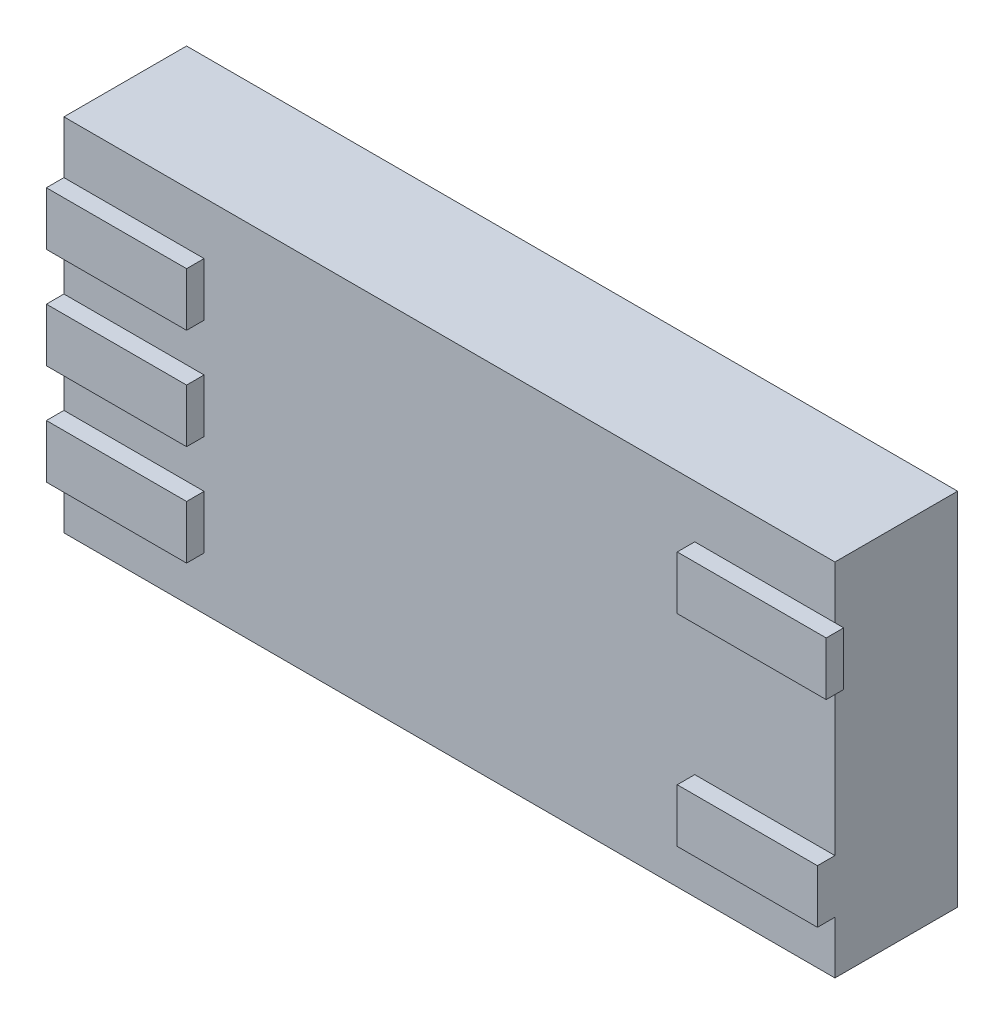
ISO-10303-21;
HEADER;
FILE_DESCRIPTION(('STEP AP214'),'2;1');
FILE_NAME('part.step','',(''),(''),'','','');
FILE_SCHEMA(('AUTOMOTIVE_DESIGN { 1 0 10303 214 1 1 1 1 }'));
ENDSEC;
DATA;
#1=APPLICATION_CONTEXT('core data for automotive mechanical design processes');
#2=APPLICATION_PROTOCOL_DEFINITION('international standard','automotive_design',2000,#1);
#3=PRODUCT_CONTEXT('',#1,'mechanical');
#4=PRODUCT('Part','Part','',(#3));
#5=PRODUCT_RELATED_PRODUCT_CATEGORY('part','',(#4));
#6=PRODUCT_DEFINITION_FORMATION('','',#4);
#7=PRODUCT_DEFINITION_CONTEXT('part definition',#1,'design');
#8=PRODUCT_DEFINITION('design','',#6,#7);
#9=PRODUCT_DEFINITION_SHAPE('','',#8);
#10=(LENGTH_UNIT() NAMED_UNIT(*) SI_UNIT(.MILLI.,.METRE.));
#11=(NAMED_UNIT(*) PLANE_ANGLE_UNIT() SI_UNIT($,.RADIAN.));
#12=(NAMED_UNIT(*) SI_UNIT($,.STERADIAN.) SOLID_ANGLE_UNIT());
#13=UNCERTAINTY_MEASURE_WITH_UNIT(LENGTH_MEASURE(1.E-05),#10,'distance_accuracy_value','');
#14=(GEOMETRIC_REPRESENTATION_CONTEXT(3) GLOBAL_UNCERTAINTY_ASSIGNED_CONTEXT((#13)) GLOBAL_UNIT_ASSIGNED_CONTEXT((#10,
#11,#12)) REPRESENTATION_CONTEXT('',''));
#15=CARTESIAN_POINT('',(0.,0.,0.));
#16=DIRECTION('',(0.,0.,1.));
#17=DIRECTION('',(1.,0.,0.));
#18=AXIS2_PLACEMENT_3D('',#15,#16,#17);
#19=CARTESIAN_POINT('',(55.88,26.1112,8.89));
#20=DIRECTION('',(-1.,0.,0.));
#21=DIRECTION('',(0.,-1.,0.));
#22=AXIS2_PLACEMENT_3D('',#19,#20,#21);
#23=PLANE('',#22);
#24=DIRECTION('',(0.,1.,0.));
#25=VECTOR('',#24,1.);
#26=CARTESIAN_POINT('',(55.88,22.29590234352,8.89));
#27=LINE('',#26,#25);
#28=CARTESIAN_POINT('',(55.88,18.4260321312766,8.89));
#29=VERTEX_POINT('',#28);
#30=CARTESIAN_POINT('',(55.88,22.29590234352,8.89));
#31=VERTEX_POINT('',#30);
#32=EDGE_CURVE('E229',#29,#31,#27,.T.);
#33=ORIENTED_EDGE('',*,*,#32,.F.);
#34=DIRECTION('',(0.,1.,0.));
#35=VECTOR('',#34,1.);
#36=CARTESIAN_POINT('',(55.88,26.1112,8.89));
#37=LINE('',#36,#35);
#38=CARTESIAN_POINT('',(55.88,7.68516786872343,8.89));
#39=VERTEX_POINT('',#38);
#40=EDGE_CURVE('E400',#39,#29,#37,.T.);
#41=ORIENTED_EDGE('',*,*,#40,.F.);
#42=DIRECTION('',(0.,0.,-1.));
#43=VECTOR('',#42,1.);
#44=CARTESIAN_POINT('',(55.88,7.68516786872343,10.16));
#45=LINE('',#44,#43);
#46=CARTESIAN_POINT('',(55.88,7.68516786872343,10.16));
#47=VERTEX_POINT('',#46);
#48=EDGE_CURVE('E272',#47,#39,#45,.T.);
#49=ORIENTED_EDGE('',*,*,#48,.F.);
#50=DIRECTION('',(0.,1.,0.));
#51=VECTOR('',#50,1.);
#52=CARTESIAN_POINT('',(55.88,7.68516786872343,10.16));
#53=LINE('',#52,#51);
#54=CARTESIAN_POINT('',(55.88,3.81529765647998,10.16));
#55=VERTEX_POINT('',#54);
#56=EDGE_CURVE('E258',#55,#47,#53,.T.);
#57=ORIENTED_EDGE('',*,*,#56,.F.);
#58=DIRECTION('',(0.,0.,-1.));
#59=VECTOR('',#58,1.);
#60=CARTESIAN_POINT('',(55.88,3.81529765647998,10.16));
#61=LINE('',#60,#59);
#62=CARTESIAN_POINT('',(55.88,3.81529765647998,8.89));
#63=VERTEX_POINT('',#62);
#64=EDGE_CURVE('E275',#55,#63,#61,.T.);
#65=ORIENTED_EDGE('',*,*,#64,.T.);
#66=CARTESIAN_POINT('',(55.88,0.,8.89));
#67=VERTEX_POINT('',#66);
#68=EDGE_CURVE('E399',#67,#63,#37,.T.);
#69=ORIENTED_EDGE('',*,*,#68,.F.);
#70=DIRECTION('',(0.,0.,-1.));
#71=VECTOR('',#70,1.);
#72=CARTESIAN_POINT('',(55.88,0.,8.89));
#73=LINE('',#72,#71);
#74=CARTESIAN_POINT('',(55.88,0.,0.));
#75=VERTEX_POINT('',#74);
#76=EDGE_CURVE('E45',#67,#75,#73,.T.);
#77=ORIENTED_EDGE('',*,*,#76,.T.);
#78=DIRECTION('',(0.,1.,0.));
#79=VECTOR('',#78,1.);
#80=CARTESIAN_POINT('',(55.88,26.1112,0.));
#81=LINE('',#80,#79);
#82=CARTESIAN_POINT('',(55.88,26.1112,0.));
#83=VERTEX_POINT('',#82);
#84=EDGE_CURVE('E391',#75,#83,#81,.T.);
#85=ORIENTED_EDGE('',*,*,#84,.T.);
#86=DIRECTION('',(0.,0.,-1.));
#87=VECTOR('',#86,1.);
#88=CARTESIAN_POINT('',(55.88,26.1112,8.89));
#89=LINE('',#88,#87);
#90=CARTESIAN_POINT('',(55.88,26.1112,8.89));
#91=VERTEX_POINT('',#90);
#92=EDGE_CURVE('E383',#91,#83,#89,.T.);
#93=ORIENTED_EDGE('',*,*,#92,.F.);
#94=EDGE_CURVE('E401',#31,#91,#37,.T.);
#95=ORIENTED_EDGE('',*,*,#94,.F.);
#96=EDGE_LOOP('',(#33,#41,#49,#57,#65,#69,#77,#85,#93,#95));
#97=FACE_BOUND('',#96,.T.);
#98=ADVANCED_FACE('F35',(#97),#23,.F.);
#99=CARTESIAN_POINT('',(0.,0.,8.89));
#100=DIRECTION('',(0.,0.,1.));
#101=DIRECTION('',(1.,0.,0.));
#102=AXIS2_PLACEMENT_3D('',#99,#100,#101);
#103=PLANE('',#102);
#104=ORIENTED_EDGE('',*,*,#40,.T.);
#105=DIRECTION('',(1.,0.,0.));
#106=VECTOR('',#105,1.);
#107=CARTESIAN_POINT('',(45.72,18.4260321312766,8.89));
#108=LINE('',#107,#106);
#109=CARTESIAN_POINT('',(45.72,18.4260321312766,8.89));
#110=VERTEX_POINT('',#109);
#111=EDGE_CURVE('E53',#110,#29,#108,.T.);
#112=ORIENTED_EDGE('',*,*,#111,.F.);
#113=DIRECTION('',(0.,-1.,0.));
#114=VECTOR('',#113,1.);
#115=CARTESIAN_POINT('',(45.72,22.29590234352,8.89));
#116=LINE('',#115,#114);
#117=CARTESIAN_POINT('',(45.72,22.29590234352,8.89));
#118=VERTEX_POINT('',#117);
#119=EDGE_CURVE('E58',#118,#110,#116,.T.);
#120=ORIENTED_EDGE('',*,*,#119,.F.);
#121=DIRECTION('',(-1.,0.,0.));
#122=VECTOR('',#121,1.);
#123=CARTESIAN_POINT('',(45.72,22.29590234352,8.89));
#124=LINE('',#123,#122);
#125=EDGE_CURVE('E240',#31,#118,#124,.T.);
#126=ORIENTED_EDGE('',*,*,#125,.F.);
#127=ORIENTED_EDGE('',*,*,#94,.T.);
#128=DIRECTION('',(-1.,0.,0.));
#129=VECTOR('',#128,1.);
#130=CARTESIAN_POINT('',(0.,26.1112,8.89));
#131=LINE('',#130,#129);
#132=CARTESIAN_POINT('',(0.,26.1112,8.89));
#133=VERTEX_POINT('',#132);
#134=EDGE_CURVE('E389',#91,#133,#131,.T.);
#135=ORIENTED_EDGE('',*,*,#134,.T.);
#136=DIRECTION('',(0.,-1.,0.));
#137=VECTOR('',#136,1.);
#138=CARTESIAN_POINT('',(0.,26.1112,8.89));
#139=LINE('',#138,#137);
#140=CARTESIAN_POINT('',(0.,22.29590234352,8.89));
#141=VERTEX_POINT('',#140);
#142=EDGE_CURVE('E379',#133,#141,#139,.T.);
#143=ORIENTED_EDGE('',*,*,#142,.T.);
#144=DIRECTION('',(-1.,0.,0.));
#145=VECTOR('',#144,1.);
#146=CARTESIAN_POINT('',(0.,22.29590234352,8.89));
#147=LINE('',#146,#145);
#148=CARTESIAN_POINT('',(10.16,22.29590234352,8.89));
#149=VERTEX_POINT('',#148);
#150=EDGE_CURVE('E286',#149,#141,#147,.T.);
#151=ORIENTED_EDGE('',*,*,#150,.F.);
#152=DIRECTION('',(0.,1.,0.));
#153=VECTOR('',#152,1.);
#154=CARTESIAN_POINT('',(10.16,22.29590234352,8.89));
#155=LINE('',#154,#153);
#156=CARTESIAN_POINT('',(10.16,18.4260321312766,8.89));
#157=VERTEX_POINT('',#156);
#158=EDGE_CURVE('E295',#157,#149,#155,.T.);
#159=ORIENTED_EDGE('',*,*,#158,.F.);
#160=DIRECTION('',(1.,0.,0.));
#161=VECTOR('',#160,1.);
#162=CARTESIAN_POINT('',(0.,18.4260321312766,8.89));
#163=LINE('',#162,#161);
#164=CARTESIAN_POINT('',(0.,18.4260321312766,8.89));
#165=VERTEX_POINT('',#164);
#166=EDGE_CURVE('E281',#165,#157,#163,.T.);
#167=ORIENTED_EDGE('',*,*,#166,.F.);
#168=CARTESIAN_POINT('',(0.,14.9905351061217,8.89));
#169=VERTEX_POINT('',#168);
#170=EDGE_CURVE('E39',#165,#169,#139,.T.);
#171=ORIENTED_EDGE('',*,*,#170,.T.);
#172=DIRECTION('',(-1.,0.,0.));
#173=VECTOR('',#172,1.);
#174=CARTESIAN_POINT('',(0.,14.9905351061217,8.89));
#175=LINE('',#174,#173);
#176=CARTESIAN_POINT('',(10.16,14.9905351061217,8.89));
#177=VERTEX_POINT('',#176);
#178=EDGE_CURVE('E342',#177,#169,#175,.T.);
#179=ORIENTED_EDGE('',*,*,#178,.F.);
#180=DIRECTION('',(0.,1.,0.));
#181=VECTOR('',#180,1.);
#182=CARTESIAN_POINT('',(10.16,14.9905351061217,8.89));
#183=LINE('',#182,#181);
#184=CARTESIAN_POINT('',(10.16,11.1206648938783,8.89));
#185=VERTEX_POINT('',#184);
#186=EDGE_CURVE('E349',#185,#177,#183,.T.);
#187=ORIENTED_EDGE('',*,*,#186,.F.);
#188=DIRECTION('',(1.,0.,0.));
#189=VECTOR('',#188,1.);
#190=CARTESIAN_POINT('',(0.,11.1206648938783,8.89));
#191=LINE('',#190,#189);
#192=CARTESIAN_POINT('',(0.,11.1206648938783,8.89));
#193=VERTEX_POINT('',#192);
#194=EDGE_CURVE('E337',#193,#185,#191,.T.);
#195=ORIENTED_EDGE('',*,*,#194,.F.);
#196=CARTESIAN_POINT('',(0.,7.68516786872344,8.89));
#197=VERTEX_POINT('',#196);
#198=EDGE_CURVE('E366',#193,#197,#139,.T.);
#199=ORIENTED_EDGE('',*,*,#198,.T.);
#200=DIRECTION('',(-1.,0.,0.));
#201=VECTOR('',#200,1.);
#202=CARTESIAN_POINT('',(0.,7.68516786872344,8.89));
#203=LINE('',#202,#201);
#204=CARTESIAN_POINT('',(10.16,7.68516786872344,8.89));
#205=VERTEX_POINT('',#204);
#206=EDGE_CURVE('E316',#205,#197,#203,.T.);
#207=ORIENTED_EDGE('',*,*,#206,.F.);
#208=DIRECTION('',(0.,1.,0.));
#209=VECTOR('',#208,1.);
#210=CARTESIAN_POINT('',(10.16,7.68516786872344,8.89));
#211=LINE('',#210,#209);
#212=CARTESIAN_POINT('',(10.16,3.81529765647998,8.89));
#213=VERTEX_POINT('',#212);
#214=EDGE_CURVE('E324',#213,#205,#211,.T.);
#215=ORIENTED_EDGE('',*,*,#214,.F.);
#216=DIRECTION('',(1.,0.,0.));
#217=VECTOR('',#216,1.);
#218=CARTESIAN_POINT('',(0.,3.81529765647998,8.89));
#219=LINE('',#218,#217);
#220=CARTESIAN_POINT('',(0.,3.81529765647998,8.89));
#221=VERTEX_POINT('',#220);
#222=EDGE_CURVE('E311',#221,#213,#219,.T.);
#223=ORIENTED_EDGE('',*,*,#222,.F.);
#224=CARTESIAN_POINT('',(0.,0.,8.89));
#225=VERTEX_POINT('',#224);
#226=EDGE_CURVE('E365',#221,#225,#139,.T.);
#227=ORIENTED_EDGE('',*,*,#226,.T.);
#228=DIRECTION('',(1.,0.,0.));
#229=VECTOR('',#228,1.);
#230=CARTESIAN_POINT('',(0.,0.,8.89));
#231=LINE('',#230,#229);
#232=EDGE_CURVE('E371',#225,#67,#231,.T.);
#233=ORIENTED_EDGE('',*,*,#232,.T.);
#234=ORIENTED_EDGE('',*,*,#68,.T.);
#235=DIRECTION('',(1.,0.,0.));
#236=VECTOR('',#235,1.);
#237=CARTESIAN_POINT('',(45.72,3.81529765647998,8.89));
#238=LINE('',#237,#236);
#239=CARTESIAN_POINT('',(45.72,3.81529765647998,8.89));
#240=VERTEX_POINT('',#239);
#241=EDGE_CURVE('E265',#240,#63,#238,.T.);
#242=ORIENTED_EDGE('',*,*,#241,.F.);
#243=DIRECTION('',(0.,-1.,0.));
#244=VECTOR('',#243,1.);
#245=CARTESIAN_POINT('',(45.72,7.68516786872343,8.89));
#246=LINE('',#245,#244);
#247=CARTESIAN_POINT('',(45.72,7.68516786872343,8.89));
#248=VERTEX_POINT('',#247);
#249=EDGE_CURVE('E251',#248,#240,#246,.T.);
#250=ORIENTED_EDGE('',*,*,#249,.F.);
#251=DIRECTION('',(-1.,0.,0.));
#252=VECTOR('',#251,1.);
#253=CARTESIAN_POINT('',(45.72,7.68516786872343,8.89));
#254=LINE('',#253,#252);
#255=EDGE_CURVE('E256',#39,#248,#254,.T.);
#256=ORIENTED_EDGE('',*,*,#255,.F.);
#257=EDGE_LOOP('',(#104,#112,#120,#126,#127,#135,#143,#151,#159,#167,#171,#179,#187,#195,#199,
#207,#215,#223,#227,#233,#234,#242,#250,#256));
#258=FACE_BOUND('',#257,.T.);
#259=ADVANCED_FACE('F407',(#258),#103,.T.);
#260=CARTESIAN_POINT('',(0.,26.1112,8.89));
#261=DIRECTION('',(1.,0.,0.));
#262=DIRECTION('',(0.,1.,0.));
#263=AXIS2_PLACEMENT_3D('',#260,#261,#262);
#264=PLANE('',#263);
#265=DIRECTION('',(0.,-1.,0.));
#266=VECTOR('',#265,1.);
#267=CARTESIAN_POINT('',(0.,26.1112,0.));
#268=LINE('',#267,#266);
#269=CARTESIAN_POINT('',(0.,26.1112,0.));
#270=VERTEX_POINT('',#269);
#271=CARTESIAN_POINT('',(0.,0.,0.));
#272=VERTEX_POINT('',#271);
#273=EDGE_CURVE('E395',#270,#272,#268,.T.);
#274=ORIENTED_EDGE('',*,*,#273,.T.);
#275=DIRECTION('',(0.,0.,-1.));
#276=VECTOR('',#275,1.);
#277=CARTESIAN_POINT('',(0.,0.,8.89));
#278=LINE('',#277,#276);
#279=EDGE_CURVE('E11',#225,#272,#278,.T.);
#280=ORIENTED_EDGE('',*,*,#279,.F.);
#281=ORIENTED_EDGE('',*,*,#226,.F.);
#282=DIRECTION('',(0.,0.,-1.));
#283=VECTOR('',#282,1.);
#284=CARTESIAN_POINT('',(0.,3.81529765647998,10.16));
#285=LINE('',#284,#283);
#286=CARTESIAN_POINT('',(0.,3.81529765647998,10.16));
#287=VERTEX_POINT('',#286);
#288=EDGE_CURVE('E335',#287,#221,#285,.T.);
#289=ORIENTED_EDGE('',*,*,#288,.F.);
#290=DIRECTION('',(0.,-1.,0.));
#291=VECTOR('',#290,1.);
#292=CARTESIAN_POINT('',(0.,7.68516786872344,10.16));
#293=LINE('',#292,#291);
#294=CARTESIAN_POINT('',(0.,7.68516786872344,10.16));
#295=VERTEX_POINT('',#294);
#296=EDGE_CURVE('E312',#295,#287,#293,.T.);
#297=ORIENTED_EDGE('',*,*,#296,.F.);
#298=DIRECTION('',(0.,0.,-1.));
#299=VECTOR('',#298,1.);
#300=CARTESIAN_POINT('',(0.,7.68516786872344,10.16));
#301=LINE('',#300,#299);
#302=EDGE_CURVE('E322',#295,#197,#301,.T.);
#303=ORIENTED_EDGE('',*,*,#302,.T.);
#304=ORIENTED_EDGE('',*,*,#198,.F.);
#305=DIRECTION('',(0.,0.,-1.));
#306=VECTOR('',#305,1.);
#307=CARTESIAN_POINT('',(0.,11.1206648938783,10.16));
#308=LINE('',#307,#306);
#309=CARTESIAN_POINT('',(0.,11.1206648938783,10.16));
#310=VERTEX_POINT('',#309);
#311=EDGE_CURVE('E398',#310,#193,#308,.T.);
#312=ORIENTED_EDGE('',*,*,#311,.F.);
#313=DIRECTION('',(0.,-1.,0.));
#314=VECTOR('',#313,1.);
#315=CARTESIAN_POINT('',(0.,14.9905351061217,10.16));
#316=LINE('',#315,#314);
#317=CARTESIAN_POINT('',(0.,14.9905351061217,10.16));
#318=VERTEX_POINT('',#317);
#319=EDGE_CURVE('E338',#318,#310,#316,.T.);
#320=ORIENTED_EDGE('',*,*,#319,.F.);
#321=DIRECTION('',(0.,0.,-1.));
#322=VECTOR('',#321,1.);
#323=CARTESIAN_POINT('',(0.,14.9905351061217,10.16));
#324=LINE('',#323,#322);
#325=EDGE_CURVE('E348',#318,#169,#324,.T.);
#326=ORIENTED_EDGE('',*,*,#325,.T.);
#327=ORIENTED_EDGE('',*,*,#170,.F.);
#328=DIRECTION('',(0.,0.,-1.));
#329=VECTOR('',#328,1.);
#330=CARTESIAN_POINT('',(0.,18.4260321312766,10.16));
#331=LINE('',#330,#329);
#332=CARTESIAN_POINT('',(0.,18.4260321312766,10.16));
#333=VERTEX_POINT('',#332);
#334=EDGE_CURVE('E308',#333,#165,#331,.T.);
#335=ORIENTED_EDGE('',*,*,#334,.F.);
#336=DIRECTION('',(0.,-1.,0.));
#337=VECTOR('',#336,1.);
#338=CARTESIAN_POINT('',(0.,22.29590234352,10.16));
#339=LINE('',#338,#337);
#340=CARTESIAN_POINT('',(0.,22.29590234352,10.16));
#341=VERTEX_POINT('',#340);
#342=EDGE_CURVE('E282',#341,#333,#339,.T.);
#343=ORIENTED_EDGE('',*,*,#342,.F.);
#344=DIRECTION('',(0.,0.,-1.));
#345=VECTOR('',#344,1.);
#346=CARTESIAN_POINT('',(0.,22.29590234352,10.16));
#347=LINE('',#346,#345);
#348=EDGE_CURVE('E292',#341,#141,#347,.T.);
#349=ORIENTED_EDGE('',*,*,#348,.T.);
#350=ORIENTED_EDGE('',*,*,#142,.F.);
#351=DIRECTION('',(0.,0.,-1.));
#352=VECTOR('',#351,1.);
#353=CARTESIAN_POINT('',(0.,26.1112,8.89));
#354=LINE('',#353,#352);
#355=EDGE_CURVE('E386',#133,#270,#354,.T.);
#356=ORIENTED_EDGE('',*,*,#355,.T.);
#357=EDGE_LOOP('',(#274,#280,#281,#289,#297,#303,#304,#312,#320,#326,#327,#335,#343,#349,#350,#356));
#358=FACE_BOUND('',#357,.T.);
#359=ADVANCED_FACE('F37',(#358),#264,.F.);
#360=CARTESIAN_POINT('',(0.,0.,8.89));
#361=DIRECTION('',(0.,1.,0.));
#362=DIRECTION('',(0.,0.,1.));
#363=AXIS2_PLACEMENT_3D('',#360,#361,#362);
#364=PLANE('',#363);
#365=DIRECTION('',(1.,0.,0.));
#366=VECTOR('',#365,1.);
#367=CARTESIAN_POINT('',(0.,0.,0.));
#368=LINE('',#367,#366);
#369=EDGE_CURVE('E393',#272,#75,#368,.T.);
#370=ORIENTED_EDGE('',*,*,#369,.T.);
#371=ORIENTED_EDGE('',*,*,#76,.F.);
#372=ORIENTED_EDGE('',*,*,#232,.F.);
#373=ORIENTED_EDGE('',*,*,#279,.T.);
#374=EDGE_LOOP('',(#370,#371,#372,#373));
#375=FACE_BOUND('',#374,.T.);
#376=ADVANCED_FACE('F412',(#375),#364,.F.);
#377=CARTESIAN_POINT('',(0.,26.1112,8.89));
#378=DIRECTION('',(0.,-1.,0.));
#379=DIRECTION('',(1.,0.,0.));
#380=AXIS2_PLACEMENT_3D('',#377,#378,#379);
#381=PLANE('',#380);
#382=DIRECTION('',(-1.,0.,0.));
#383=VECTOR('',#382,1.);
#384=CARTESIAN_POINT('',(0.,26.1112,0.));
#385=LINE('',#384,#383);
#386=EDGE_CURVE('E367',#83,#270,#385,.T.);
#387=ORIENTED_EDGE('',*,*,#386,.T.);
#388=ORIENTED_EDGE('',*,*,#355,.F.);
#389=ORIENTED_EDGE('',*,*,#134,.F.);
#390=ORIENTED_EDGE('',*,*,#92,.T.);
#391=EDGE_LOOP('',(#387,#388,#389,#390));
#392=FACE_BOUND('',#391,.T.);
#393=ADVANCED_FACE('F454',(#392),#381,.F.);
#394=CARTESIAN_POINT('',(0.,0.,0.));
#395=DIRECTION('',(0.,0.,1.));
#396=DIRECTION('',(1.,0.,0.));
#397=AXIS2_PLACEMENT_3D('',#394,#395,#396);
#398=PLANE('',#397);
#399=ORIENTED_EDGE('',*,*,#273,.F.);
#400=ORIENTED_EDGE('',*,*,#386,.F.);
#401=ORIENTED_EDGE('',*,*,#84,.F.);
#402=ORIENTED_EDGE('',*,*,#369,.F.);
#403=EDGE_LOOP('',(#399,#400,#401,#402));
#404=FACE_BOUND('',#403,.T.);
#405=ADVANCED_FACE('F461',(#404),#398,.F.);
#406=CARTESIAN_POINT('',(0.,11.1206648938783,10.16));
#407=DIRECTION('',(0.,1.,0.));
#408=DIRECTION('',(0.,0.,1.));
#409=AXIS2_PLACEMENT_3D('',#406,#407,#408);
#410=PLANE('',#409);
#411=ORIENTED_EDGE('',*,*,#194,.T.);
#412=DIRECTION('',(0.,0.,-1.));
#413=VECTOR('',#412,1.);
#414=CARTESIAN_POINT('',(10.16,11.1206648938783,10.16));
#415=LINE('',#414,#413);
#416=CARTESIAN_POINT('',(10.16,11.1206648938783,10.16));
#417=VERTEX_POINT('',#416);
#418=EDGE_CURVE('E370',#417,#185,#415,.T.);
#419=ORIENTED_EDGE('',*,*,#418,.F.);
#420=DIRECTION('',(1.,0.,0.));
#421=VECTOR('',#420,1.);
#422=CARTESIAN_POINT('',(0.,11.1206648938783,10.16));
#423=LINE('',#422,#421);
#424=EDGE_CURVE('E341',#310,#417,#423,.T.);
#425=ORIENTED_EDGE('',*,*,#424,.F.);
#426=ORIENTED_EDGE('',*,*,#311,.T.);
#427=EDGE_LOOP('',(#411,#419,#425,#426));
#428=FACE_BOUND('',#427,.T.);
#429=ADVANCED_FACE('F523',(#428),#410,.F.);
#430=CARTESIAN_POINT('',(10.16,14.9905351061217,10.16));
#431=DIRECTION('',(-1.,0.,0.));
#432=DIRECTION('',(0.,0.,1.));
#433=AXIS2_PLACEMENT_3D('',#430,#431,#432);
#434=PLANE('',#433);
#435=ORIENTED_EDGE('',*,*,#186,.T.);
#436=DIRECTION('',(0.,0.,-1.));
#437=VECTOR('',#436,1.);
#438=CARTESIAN_POINT('',(10.16,14.9905351061217,10.16));
#439=LINE('',#438,#437);
#440=CARTESIAN_POINT('',(10.16,14.9905351061217,10.16));
#441=VERTEX_POINT('',#440);
#442=EDGE_CURVE('E354',#441,#177,#439,.T.);
#443=ORIENTED_EDGE('',*,*,#442,.F.);
#444=DIRECTION('',(0.,1.,0.));
#445=VECTOR('',#444,1.);
#446=CARTESIAN_POINT('',(10.16,14.9905351061217,10.16));
#447=LINE('',#446,#445);
#448=EDGE_CURVE('E344',#417,#441,#447,.T.);
#449=ORIENTED_EDGE('',*,*,#448,.F.);
#450=ORIENTED_EDGE('',*,*,#418,.T.);
#451=EDGE_LOOP('',(#435,#443,#449,#450));
#452=FACE_BOUND('',#451,.T.);
#453=ADVANCED_FACE('F519',(#452),#434,.F.);
#454=CARTESIAN_POINT('',(0.,14.9905351061217,10.16));
#455=DIRECTION('',(0.,-1.,0.));
#456=DIRECTION('',(0.,0.,-1.));
#457=AXIS2_PLACEMENT_3D('',#454,#455,#456);
#458=PLANE('',#457);
#459=ORIENTED_EDGE('',*,*,#178,.T.);
#460=ORIENTED_EDGE('',*,*,#325,.F.);
#461=DIRECTION('',(-1.,0.,0.));
#462=VECTOR('',#461,1.);
#463=CARTESIAN_POINT('',(0.,14.9905351061217,10.16));
#464=LINE('',#463,#462);
#465=EDGE_CURVE('E346',#441,#318,#464,.T.);
#466=ORIENTED_EDGE('',*,*,#465,.F.);
#467=ORIENTED_EDGE('',*,*,#442,.T.);
#468=EDGE_LOOP('',(#459,#460,#466,#467));
#469=FACE_BOUND('',#468,.T.);
#470=ADVANCED_FACE('F515',(#469),#458,.F.);
#471=CARTESIAN_POINT('',(0.,0.,10.16));
#472=DIRECTION('',(0.,0.,1.));
#473=DIRECTION('',(1.,0.,0.));
#474=AXIS2_PLACEMENT_3D('',#471,#472,#473);
#475=PLANE('',#474);
#476=ORIENTED_EDGE('',*,*,#319,.T.);
#477=ORIENTED_EDGE('',*,*,#424,.T.);
#478=ORIENTED_EDGE('',*,*,#448,.T.);
#479=ORIENTED_EDGE('',*,*,#465,.T.);
#480=EDGE_LOOP('',(#476,#477,#478,#479));
#481=FACE_BOUND('',#480,.T.);
#482=ADVANCED_FACE('F511',(#481),#475,.T.);
#483=CARTESIAN_POINT('',(0.,3.81529765647998,10.16));
#484=DIRECTION('',(0.,1.,0.));
#485=DIRECTION('',(0.,0.,1.));
#486=AXIS2_PLACEMENT_3D('',#483,#484,#485);
#487=PLANE('',#486);
#488=ORIENTED_EDGE('',*,*,#222,.T.);
#489=DIRECTION('',(0.,0.,-1.));
#490=VECTOR('',#489,1.);
#491=CARTESIAN_POINT('',(10.16,3.81529765647998,10.16));
#492=LINE('',#491,#490);
#493=CARTESIAN_POINT('',(10.16,3.81529765647998,10.16));
#494=VERTEX_POINT('',#493);
#495=EDGE_CURVE('E332',#494,#213,#492,.T.);
#496=ORIENTED_EDGE('',*,*,#495,.F.);
#497=DIRECTION('',(1.,0.,0.));
#498=VECTOR('',#497,1.);
#499=CARTESIAN_POINT('',(0.,3.81529765647998,10.16));
#500=LINE('',#499,#498);
#501=EDGE_CURVE('E315',#287,#494,#500,.T.);
#502=ORIENTED_EDGE('',*,*,#501,.F.);
#503=ORIENTED_EDGE('',*,*,#288,.T.);
#504=EDGE_LOOP('',(#488,#496,#502,#503));
#505=FACE_BOUND('',#504,.T.);
#506=ADVANCED_FACE('F507',(#505),#487,.F.);
#507=CARTESIAN_POINT('',(10.16,7.68516786872344,10.16));
#508=DIRECTION('',(-1.,0.,0.));
#509=DIRECTION('',(0.,0.,1.));
#510=AXIS2_PLACEMENT_3D('',#507,#508,#509);
#511=PLANE('',#510);
#512=ORIENTED_EDGE('',*,*,#214,.T.);
#513=DIRECTION('',(0.,0.,-1.));
#514=VECTOR('',#513,1.);
#515=CARTESIAN_POINT('',(10.16,7.68516786872344,10.16));
#516=LINE('',#515,#514);
#517=CARTESIAN_POINT('',(10.16,7.68516786872344,10.16));
#518=VERTEX_POINT('',#517);
#519=EDGE_CURVE('E330',#518,#205,#516,.T.);
#520=ORIENTED_EDGE('',*,*,#519,.F.);
#521=DIRECTION('',(0.,1.,0.));
#522=VECTOR('',#521,1.);
#523=CARTESIAN_POINT('',(10.16,7.68516786872344,10.16));
#524=LINE('',#523,#522);
#525=EDGE_CURVE('E318',#494,#518,#524,.T.);
#526=ORIENTED_EDGE('',*,*,#525,.F.);
#527=ORIENTED_EDGE('',*,*,#495,.T.);
#528=EDGE_LOOP('',(#512,#520,#526,#527));
#529=FACE_BOUND('',#528,.T.);
#530=ADVANCED_FACE('F503',(#529),#511,.F.);
#531=CARTESIAN_POINT('',(0.,7.68516786872344,10.16));
#532=DIRECTION('',(0.,-1.,0.));
#533=DIRECTION('',(1.,0.,0.));
#534=AXIS2_PLACEMENT_3D('',#531,#532,#533);
#535=PLANE('',#534);
#536=ORIENTED_EDGE('',*,*,#206,.T.);
#537=ORIENTED_EDGE('',*,*,#302,.F.);
#538=DIRECTION('',(-1.,0.,0.));
#539=VECTOR('',#538,1.);
#540=CARTESIAN_POINT('',(0.,7.68516786872344,10.16));
#541=LINE('',#540,#539);
#542=EDGE_CURVE('E320',#518,#295,#541,.T.);
#543=ORIENTED_EDGE('',*,*,#542,.F.);
#544=ORIENTED_EDGE('',*,*,#519,.T.);
#545=EDGE_LOOP('',(#536,#537,#543,#544));
#546=FACE_BOUND('',#545,.T.);
#547=ADVANCED_FACE('F496',(#546),#535,.F.);
#548=CARTESIAN_POINT('',(0.,0.,10.16));
#549=DIRECTION('',(0.,0.,1.));
#550=DIRECTION('',(1.,0.,0.));
#551=AXIS2_PLACEMENT_3D('',#548,#549,#550);
#552=PLANE('',#551);
#553=ORIENTED_EDGE('',*,*,#296,.T.);
#554=ORIENTED_EDGE('',*,*,#501,.T.);
#555=ORIENTED_EDGE('',*,*,#525,.T.);
#556=ORIENTED_EDGE('',*,*,#542,.T.);
#557=EDGE_LOOP('',(#553,#554,#555,#556));
#558=FACE_BOUND('',#557,.T.);
#559=ADVANCED_FACE('F489',(#558),#552,.T.);
#560=CARTESIAN_POINT('',(0.,18.4260321312766,10.16));
#561=DIRECTION('',(0.,1.,0.));
#562=DIRECTION('',(0.,0.,1.));
#563=AXIS2_PLACEMENT_3D('',#560,#561,#562);
#564=PLANE('',#563);
#565=ORIENTED_EDGE('',*,*,#166,.T.);
#566=DIRECTION('',(0.,0.,-1.));
#567=VECTOR('',#566,1.);
#568=CARTESIAN_POINT('',(10.16,18.4260321312766,10.16));
#569=LINE('',#568,#567);
#570=CARTESIAN_POINT('',(10.16,18.4260321312766,10.16));
#571=VERTEX_POINT('',#570);
#572=EDGE_CURVE('E305',#571,#157,#569,.T.);
#573=ORIENTED_EDGE('',*,*,#572,.F.);
#574=DIRECTION('',(1.,0.,0.));
#575=VECTOR('',#574,1.);
#576=CARTESIAN_POINT('',(0.,18.4260321312766,10.16));
#577=LINE('',#576,#575);
#578=EDGE_CURVE('E285',#333,#571,#577,.T.);
#579=ORIENTED_EDGE('',*,*,#578,.F.);
#580=ORIENTED_EDGE('',*,*,#334,.T.);
#581=EDGE_LOOP('',(#565,#573,#579,#580));
#582=FACE_BOUND('',#581,.T.);
#583=ADVANCED_FACE('F487',(#582),#564,.F.);
#584=CARTESIAN_POINT('',(10.16,22.29590234352,10.16));
#585=DIRECTION('',(-1.,0.,0.));
#586=DIRECTION('',(0.,-1.,0.));
#587=AXIS2_PLACEMENT_3D('',#584,#585,#586);
#588=PLANE('',#587);
#589=ORIENTED_EDGE('',*,*,#158,.T.);
#590=DIRECTION('',(0.,0.,-1.));
#591=VECTOR('',#590,1.);
#592=CARTESIAN_POINT('',(10.16,22.29590234352,10.16));
#593=LINE('',#592,#591);
#594=CARTESIAN_POINT('',(10.16,22.29590234352,10.16));
#595=VERTEX_POINT('',#594);
#596=EDGE_CURVE('E302',#595,#149,#593,.T.);
#597=ORIENTED_EDGE('',*,*,#596,.F.);
#598=DIRECTION('',(0.,1.,0.));
#599=VECTOR('',#598,1.);
#600=CARTESIAN_POINT('',(10.16,22.29590234352,10.16));
#601=LINE('',#600,#599);
#602=EDGE_CURVE('E288',#571,#595,#601,.T.);
#603=ORIENTED_EDGE('',*,*,#602,.F.);
#604=ORIENTED_EDGE('',*,*,#572,.T.);
#605=EDGE_LOOP('',(#589,#597,#603,#604));
#606=FACE_BOUND('',#605,.T.);
#607=ADVANCED_FACE('F484',(#606),#588,.F.);
#608=CARTESIAN_POINT('',(0.,22.29590234352,10.16));
#609=DIRECTION('',(0.,-1.,0.));
#610=DIRECTION('',(0.,0.,-1.));
#611=AXIS2_PLACEMENT_3D('',#608,#609,#610);
#612=PLANE('',#611);
#613=ORIENTED_EDGE('',*,*,#150,.T.);
#614=ORIENTED_EDGE('',*,*,#348,.F.);
#615=DIRECTION('',(-1.,0.,0.));
#616=VECTOR('',#615,1.);
#617=CARTESIAN_POINT('',(0.,22.29590234352,10.16));
#618=LINE('',#617,#616);
#619=EDGE_CURVE('E290',#595,#341,#618,.T.);
#620=ORIENTED_EDGE('',*,*,#619,.F.);
#621=ORIENTED_EDGE('',*,*,#596,.T.);
#622=EDGE_LOOP('',(#613,#614,#620,#621));
#623=FACE_BOUND('',#622,.T.);
#624=ADVANCED_FACE('F474',(#623),#612,.F.);
#625=CARTESIAN_POINT('',(0.,0.,10.16));
#626=DIRECTION('',(0.,0.,1.));
#627=DIRECTION('',(1.,0.,0.));
#628=AXIS2_PLACEMENT_3D('',#625,#626,#627);
#629=PLANE('',#628);
#630=ORIENTED_EDGE('',*,*,#342,.T.);
#631=ORIENTED_EDGE('',*,*,#578,.T.);
#632=ORIENTED_EDGE('',*,*,#602,.T.);
#633=ORIENTED_EDGE('',*,*,#619,.T.);
#634=EDGE_LOOP('',(#630,#631,#632,#633));
#635=FACE_BOUND('',#634,.T.);
#636=ADVANCED_FACE('F480',(#635),#629,.T.);
#637=CARTESIAN_POINT('',(45.72,7.68516786872343,10.16));
#638=DIRECTION('',(1.,0.,0.));
#639=DIRECTION('',(0.,0.,-1.));
#640=AXIS2_PLACEMENT_3D('',#637,#638,#639);
#641=PLANE('',#640);
#642=ORIENTED_EDGE('',*,*,#249,.T.);
#643=DIRECTION('',(0.,0.,-1.));
#644=VECTOR('',#643,1.);
#645=CARTESIAN_POINT('',(45.72,3.81529765647998,10.16));
#646=LINE('',#645,#644);
#647=CARTESIAN_POINT('',(45.72,3.81529765647998,10.16));
#648=VERTEX_POINT('',#647);
#649=EDGE_CURVE('E278',#648,#240,#646,.T.);
#650=ORIENTED_EDGE('',*,*,#649,.F.);
#651=DIRECTION('',(0.,-1.,0.));
#652=VECTOR('',#651,1.);
#653=CARTESIAN_POINT('',(45.72,7.68516786872343,10.16));
#654=LINE('',#653,#652);
#655=CARTESIAN_POINT('',(45.72,7.68516786872343,10.16));
#656=VERTEX_POINT('',#655);
#657=EDGE_CURVE('E252',#656,#648,#654,.T.);
#658=ORIENTED_EDGE('',*,*,#657,.F.);
#659=DIRECTION('',(0.,0.,-1.));
#660=VECTOR('',#659,1.);
#661=CARTESIAN_POINT('',(45.72,7.68516786872343,10.16));
#662=LINE('',#661,#660);
#663=EDGE_CURVE('E262',#656,#248,#662,.T.);
#664=ORIENTED_EDGE('',*,*,#663,.T.);
#665=EDGE_LOOP('',(#642,#650,#658,#664));
#666=FACE_BOUND('',#665,.T.);
#667=ADVANCED_FACE('F428',(#666),#641,.F.);
#668=CARTESIAN_POINT('',(45.72,3.81529765647998,10.16));
#669=DIRECTION('',(0.,1.,0.));
#670=DIRECTION('',(0.,0.,1.));
#671=AXIS2_PLACEMENT_3D('',#668,#669,#670);
#672=PLANE('',#671);
#673=ORIENTED_EDGE('',*,*,#241,.T.);
#674=ORIENTED_EDGE('',*,*,#64,.F.);
#675=DIRECTION('',(1.,0.,0.));
#676=VECTOR('',#675,1.);
#677=CARTESIAN_POINT('',(45.72,3.81529765647998,10.16));
#678=LINE('',#677,#676);
#679=EDGE_CURVE('E255',#648,#55,#678,.T.);
#680=ORIENTED_EDGE('',*,*,#679,.F.);
#681=ORIENTED_EDGE('',*,*,#649,.T.);
#682=EDGE_LOOP('',(#673,#674,#680,#681));
#683=FACE_BOUND('',#682,.T.);
#684=ADVANCED_FACE('F419',(#683),#672,.F.);
#685=CARTESIAN_POINT('',(45.72,7.68516786872343,10.16));
#686=DIRECTION('',(0.,-1.,0.));
#687=DIRECTION('',(0.,0.,-1.));
#688=AXIS2_PLACEMENT_3D('',#685,#686,#687);
#689=PLANE('',#688);
#690=ORIENTED_EDGE('',*,*,#255,.T.);
#691=ORIENTED_EDGE('',*,*,#663,.F.);
#692=DIRECTION('',(-1.,0.,0.));
#693=VECTOR('',#692,1.);
#694=CARTESIAN_POINT('',(45.72,7.68516786872343,10.16));
#695=LINE('',#694,#693);
#696=EDGE_CURVE('E260',#47,#656,#695,.T.);
#697=ORIENTED_EDGE('',*,*,#696,.F.);
#698=ORIENTED_EDGE('',*,*,#48,.T.);
#699=EDGE_LOOP('',(#690,#691,#697,#698));
#700=FACE_BOUND('',#699,.T.);
#701=ADVANCED_FACE('F425',(#700),#689,.F.);
#702=CARTESIAN_POINT('',(0.,0.,10.16));
#703=DIRECTION('',(0.,0.,1.));
#704=DIRECTION('',(1.,0.,0.));
#705=AXIS2_PLACEMENT_3D('',#702,#703,#704);
#706=PLANE('',#705);
#707=ORIENTED_EDGE('',*,*,#657,.T.);
#708=ORIENTED_EDGE('',*,*,#679,.T.);
#709=ORIENTED_EDGE('',*,*,#56,.T.);
#710=ORIENTED_EDGE('',*,*,#696,.T.);
#711=EDGE_LOOP('',(#707,#708,#709,#710));
#712=FACE_BOUND('',#711,.T.);
#713=ADVANCED_FACE('F430',(#712),#706,.T.);
#714=CARTESIAN_POINT('',(45.72,22.29590234352,10.16));
#715=DIRECTION('',(1.,0.,0.));
#716=DIRECTION('',(0.,0.,-1.));
#717=AXIS2_PLACEMENT_3D('',#714,#715,#716);
#718=PLANE('',#717);
#719=ORIENTED_EDGE('',*,*,#119,.T.);
#720=DIRECTION('',(0.,0.,-1.));
#721=VECTOR('',#720,1.);
#722=CARTESIAN_POINT('',(45.72,18.4260321312766,10.16));
#723=LINE('',#722,#721);
#724=CARTESIAN_POINT('',(45.72,18.4260321312766,10.16));
#725=VERTEX_POINT('',#724);
#726=EDGE_CURVE('E249',#725,#110,#723,.T.);
#727=ORIENTED_EDGE('',*,*,#726,.F.);
#728=DIRECTION('',(0.,-1.,0.));
#729=VECTOR('',#728,1.);
#730=CARTESIAN_POINT('',(45.72,22.29590234352,10.16));
#731=LINE('',#730,#729);
#732=CARTESIAN_POINT('',(45.72,22.29590234352,10.16));
#733=VERTEX_POINT('',#732);
#734=EDGE_CURVE('E211',#733,#725,#731,.T.);
#735=ORIENTED_EDGE('',*,*,#734,.F.);
#736=DIRECTION('',(0.,0.,-1.));
#737=VECTOR('',#736,1.);
#738=CARTESIAN_POINT('',(45.72,22.29590234352,10.16));
#739=LINE('',#738,#737);
#740=EDGE_CURVE('E243',#733,#118,#739,.T.);
#741=ORIENTED_EDGE('',*,*,#740,.T.);
#742=EDGE_LOOP('',(#719,#727,#735,#741));
#743=FACE_BOUND('',#742,.T.);
#744=ADVANCED_FACE('F438',(#743),#718,.F.);
#745=CARTESIAN_POINT('',(45.72,18.4260321312766,10.16));
#746=DIRECTION('',(0.,1.,0.));
#747=DIRECTION('',(0.,0.,1.));
#748=AXIS2_PLACEMENT_3D('',#745,#746,#747);
#749=PLANE('',#748);
#750=ORIENTED_EDGE('',*,*,#111,.T.);
#751=DIRECTION('',(-1.,0.,0.));
#752=VECTOR('',#751,1.);
#753=CARTESIAN_POINT('',(56.515,18.4260321312766,8.89));
#754=LINE('',#753,#752);
#755=CARTESIAN_POINT('',(56.515,18.4260321312766,8.89));
#756=VERTEX_POINT('',#755);
#757=EDGE_CURVE('E220',#756,#29,#754,.T.);
#758=ORIENTED_EDGE('',*,*,#757,.F.);
#759=DIRECTION('',(0.,0.,-1.));
#760=VECTOR('',#759,1.);
#761=CARTESIAN_POINT('',(56.515,18.4260321312766,10.16));
#762=LINE('',#761,#760);
#763=CARTESIAN_POINT('',(56.515,18.4260321312766,10.16));
#764=VERTEX_POINT('',#763);
#765=EDGE_CURVE('E217',#764,#756,#762,.T.);
#766=ORIENTED_EDGE('',*,*,#765,.F.);
#767=DIRECTION('',(1.,0.,0.));
#768=VECTOR('',#767,1.);
#769=CARTESIAN_POINT('',(45.72,18.4260321312766,10.16));
#770=LINE('',#769,#768);
#771=EDGE_CURVE('E205',#725,#764,#770,.T.);
#772=ORIENTED_EDGE('',*,*,#771,.F.);
#773=ORIENTED_EDGE('',*,*,#726,.T.);
#774=EDGE_LOOP('',(#750,#758,#766,#772,#773));
#775=FACE_BOUND('',#774,.T.);
#776=ADVANCED_FACE('F218',(#775),#749,.F.);
#777=CARTESIAN_POINT('',(45.72,22.29590234352,10.16));
#778=DIRECTION('',(0.,-1.,0.));
#779=DIRECTION('',(0.,0.,-1.));
#780=AXIS2_PLACEMENT_3D('',#777,#778,#779);
#781=PLANE('',#780);
#782=ORIENTED_EDGE('',*,*,#125,.T.);
#783=ORIENTED_EDGE('',*,*,#740,.F.);
#784=DIRECTION('',(-1.,0.,0.));
#785=VECTOR('',#784,1.);
#786=CARTESIAN_POINT('',(45.72,22.29590234352,10.16));
#787=LINE('',#786,#785);
#788=CARTESIAN_POINT('',(56.515,22.29590234352,10.16));
#789=VERTEX_POINT('',#788);
#790=EDGE_CURVE('E214',#789,#733,#787,.T.);
#791=ORIENTED_EDGE('',*,*,#790,.F.);
#792=DIRECTION('',(0.,0.,1.));
#793=VECTOR('',#792,1.);
#794=CARTESIAN_POINT('',(56.515,22.29590234352,10.16));
#795=LINE('',#794,#793);
#796=CARTESIAN_POINT('',(56.515,22.29590234352,8.89));
#797=VERTEX_POINT('',#796);
#798=EDGE_CURVE('E228',#797,#789,#795,.T.);
#799=ORIENTED_EDGE('',*,*,#798,.F.);
#800=DIRECTION('',(-1.,0.,0.));
#801=VECTOR('',#800,1.);
#802=CARTESIAN_POINT('',(56.515,22.29590234352,8.89));
#803=LINE('',#802,#801);
#804=EDGE_CURVE('E235',#797,#31,#803,.T.);
#805=ORIENTED_EDGE('',*,*,#804,.T.);
#806=EDGE_LOOP('',(#782,#783,#791,#799,#805));
#807=FACE_BOUND('',#806,.T.);
#808=ADVANCED_FACE('F435',(#807),#781,.F.);
#809=CARTESIAN_POINT('',(0.,0.,10.16));
#810=DIRECTION('',(0.,0.,1.));
#811=DIRECTION('',(1.,0.,0.));
#812=AXIS2_PLACEMENT_3D('',#809,#810,#811);
#813=PLANE('',#812);
#814=ORIENTED_EDGE('',*,*,#734,.T.);
#815=ORIENTED_EDGE('',*,*,#771,.T.);
#816=DIRECTION('',(0.,-1.,0.));
#817=VECTOR('',#816,1.);
#818=CARTESIAN_POINT('',(56.515,22.29590234352,10.16));
#819=LINE('',#818,#817);
#820=EDGE_CURVE('E209',#789,#764,#819,.T.);
#821=ORIENTED_EDGE('',*,*,#820,.F.);
#822=ORIENTED_EDGE('',*,*,#790,.T.);
#823=EDGE_LOOP('',(#814,#815,#821,#822));
#824=FACE_BOUND('',#823,.T.);
#825=ADVANCED_FACE('F207',(#824),#813,.T.);
#826=CARTESIAN_POINT('',(56.515,22.29590234352,8.89));
#827=DIRECTION('',(0.,0.,1.));
#828=DIRECTION('',(1.,0.,0.));
#829=AXIS2_PLACEMENT_3D('',#826,#827,#828);
#830=PLANE('',#829);
#831=ORIENTED_EDGE('',*,*,#32,.T.);
#832=ORIENTED_EDGE('',*,*,#804,.F.);
#833=DIRECTION('',(0.,1.,0.));
#834=VECTOR('',#833,1.);
#835=CARTESIAN_POINT('',(56.515,22.29590234352,8.89));
#836=LINE('',#835,#834);
#837=EDGE_CURVE('E223',#756,#797,#836,.T.);
#838=ORIENTED_EDGE('',*,*,#837,.F.);
#839=ORIENTED_EDGE('',*,*,#757,.T.);
#840=EDGE_LOOP('',(#831,#832,#838,#839));
#841=FACE_BOUND('',#840,.T.);
#842=ADVANCED_FACE('F432',(#841),#830,.F.);
#843=CARTESIAN_POINT('',(56.515,1.00533462684702E-13,0.));
#844=DIRECTION('',(1.,0.,0.));
#845=DIRECTION('',(0.,1.,0.));
#846=AXIS2_PLACEMENT_3D('',#843,#844,#845);
#847=PLANE('',#846);
#848=ORIENTED_EDGE('',*,*,#820,.T.);
#849=ORIENTED_EDGE('',*,*,#765,.T.);
#850=ORIENTED_EDGE('',*,*,#837,.T.);
#851=ORIENTED_EDGE('',*,*,#798,.T.);
#852=EDGE_LOOP('',(#848,#849,#850,#851));
#853=FACE_BOUND('',#852,.T.);
#854=ADVANCED_FACE('F226',(#853),#847,.T.);
#855=CLOSED_SHELL('',(#98,#259,#359,#376,#393,#405,#429,#453,#470,#482,#506,#530,#547,#559,#583,
#607,#624,#636,#667,#684,#701,#713,#744,#776,#808,#825,#842,#854));
#856=MANIFOLD_SOLID_BREP('B2',#855);
#857=ADVANCED_BREP_SHAPE_REPRESENTATION('',(#18,#856),#14);
#858=SHAPE_DEFINITION_REPRESENTATION(#9,#857);
ENDSEC;
END-ISO-10303-21;
